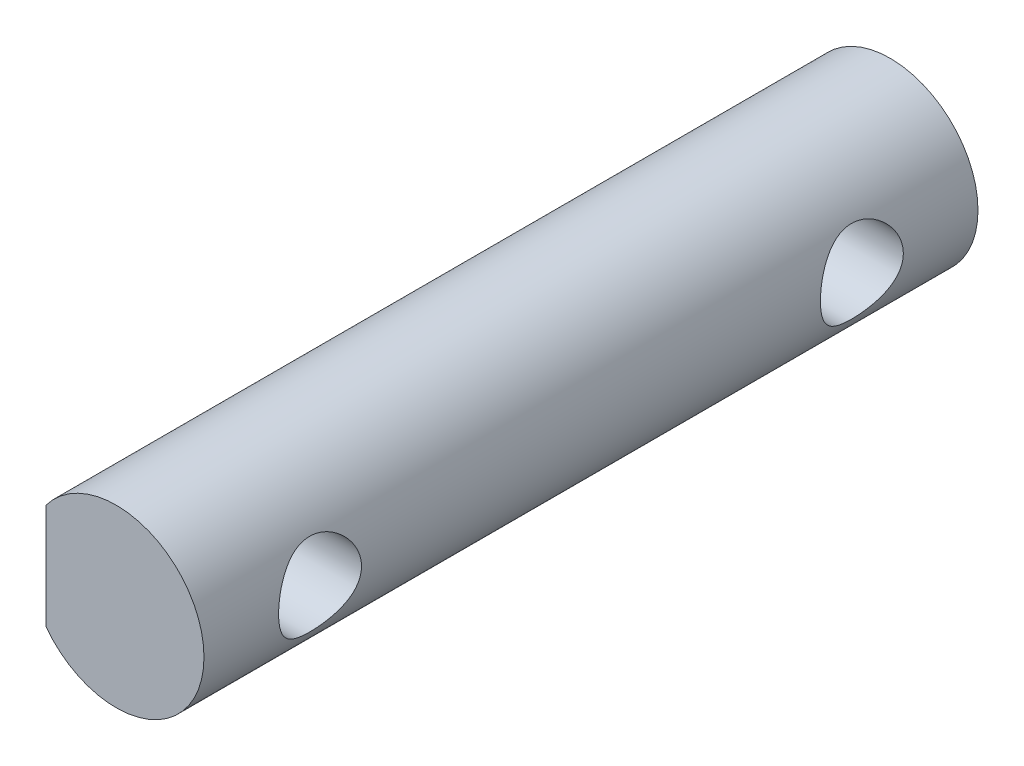
ISO-10303-21;
HEADER;
FILE_DESCRIPTION(('STEP AP214'),'2;1');
FILE_NAME('part.step','',(''),(''),'','','');
FILE_SCHEMA(('AUTOMOTIVE_DESIGN { 1 0 10303 214 1 1 1 1 }'));
ENDSEC;
DATA;
#1=APPLICATION_CONTEXT('core data for automotive mechanical design processes');
#2=APPLICATION_PROTOCOL_DEFINITION('international standard','automotive_design',2000,#1);
#3=PRODUCT_CONTEXT('',#1,'mechanical');
#4=PRODUCT('Part','Part','',(#3));
#5=PRODUCT_RELATED_PRODUCT_CATEGORY('part','',(#4));
#6=PRODUCT_DEFINITION_FORMATION('','',#4);
#7=PRODUCT_DEFINITION_CONTEXT('part definition',#1,'design');
#8=PRODUCT_DEFINITION('design','',#6,#7);
#9=PRODUCT_DEFINITION_SHAPE('','',#8);
#10=(LENGTH_UNIT() NAMED_UNIT(*) SI_UNIT(.MILLI.,.METRE.));
#11=(NAMED_UNIT(*) PLANE_ANGLE_UNIT() SI_UNIT($,.RADIAN.));
#12=(NAMED_UNIT(*) SI_UNIT($,.STERADIAN.) SOLID_ANGLE_UNIT());
#13=UNCERTAINTY_MEASURE_WITH_UNIT(LENGTH_MEASURE(1.E-05),#10,'distance_accuracy_value','');
#14=(GEOMETRIC_REPRESENTATION_CONTEXT(3) GLOBAL_UNCERTAINTY_ASSIGNED_CONTEXT((#13)) GLOBAL_UNIT_ASSIGNED_CONTEXT((#10,
#11,#12)) REPRESENTATION_CONTEXT('',''));
#15=CARTESIAN_POINT('',(0.,0.,0.));
#16=DIRECTION('',(0.,0.,1.));
#17=DIRECTION('',(1.,0.,0.));
#18=AXIS2_PLACEMENT_3D('',#15,#16,#17);
#19=CARTESIAN_POINT('',(0.,0.,28.));
#20=DIRECTION('',(0.,0.,-1.));
#21=DIRECTION('',(-1.,0.,0.));
#22=AXIS2_PLACEMENT_3D('',#19,#20,#21);
#23=CYLINDRICAL_SURFACE('',#22,3.175);
#24=CARTESIAN_POINT('',(3.175,0.,5.7));
#25=CARTESIAN_POINT('',(3.17499621985294,-0.0793696056331877,5.69999552610351));
#26=CARTESIAN_POINT('',(3.17199120370814,-0.158848966213319,5.69366335348418));
#27=CARTESIAN_POINT('',(3.16026762742416,-0.3154907966577,5.6685996128575));
#28=CARTESIAN_POINT('',(3.15153670753249,-0.392647876041672,5.64984122112576));
#29=CARTESIAN_POINT('',(3.1292818514019,-0.54213461401645,5.60080463386028));
#30=CARTESIAN_POINT('',(3.11577583396693,-0.614481134826974,5.57056947468804));
#31=CARTESIAN_POINT('',(3.08523557557938,-0.75298275747988,5.49964446831745));
#32=CARTESIAN_POINT('',(3.06820187122341,-0.819138798737005,5.45895621091421));
#33=CARTESIAN_POINT('',(3.03109215002452,-0.947531977551392,5.36568662754687));
#34=CARTESIAN_POINT('',(3.01089949607389,-1.00934531536298,5.31256891765261));
#35=CARTESIAN_POINT('',(2.97016877751052,-1.12356872804671,5.19709401541805));
#36=CARTESIAN_POINT('',(2.94963048974006,-1.17597245123061,5.13473063351146));
#37=CARTESIAN_POINT('',(2.90895734211161,-1.27340721108708,4.9974843645497));
#38=CARTESIAN_POINT('',(2.88894252906622,-1.31770529611402,4.92204154314482));
#39=CARTESIAN_POINT('',(2.85350194913633,-1.39279860497067,4.76371450605077));
#40=CARTESIAN_POINT('',(2.83807319122874,-1.4236026358555,4.68083518657092));
#41=CARTESIAN_POINT('',(2.81484981523147,-1.46896762087975,4.51481732997647));
#42=CARTESIAN_POINT('',(2.80667245171199,-1.48434942407678,4.43195910458647));
#43=CARTESIAN_POINT('',(2.79782290647243,-1.50096994970779,4.26446669966953));
#44=CARTESIAN_POINT('',(2.79714463118969,-1.5022201551264,4.17983401805993));
#45=CARTESIAN_POINT('',(2.80305593263808,-1.49114871052963,4.02062469140227));
#46=CARTESIAN_POINT('',(2.80889771224103,-1.48022366031689,3.94591684055565));
#47=CARTESIAN_POINT('',(2.82589657910714,-1.44750469243097,3.79955531913525));
#48=CARTESIAN_POINT('',(2.83705508237193,-1.42570787921159,3.72790246774061));
#49=CARTESIAN_POINT('',(2.86368711079333,-1.37144042107045,3.58767854274785));
#50=CARTESIAN_POINT('',(2.87925460442575,-1.33873421633754,3.5192173067294));
#51=CARTESIAN_POINT('',(2.91294481240157,-1.26375034917989,3.38844422930819));
#52=CARTESIAN_POINT('',(2.93106865023239,-1.22146847336964,3.32613511227864));
#53=CARTESIAN_POINT('',(2.97027967308475,-1.12301829304094,3.20211398210142));
#54=CARTESIAN_POINT('',(2.99147184174414,-1.06582685913966,3.14124465826451));
#55=CARTESIAN_POINT('',(3.03276969244737,-0.941911654521739,3.02963307898786));
#56=CARTESIAN_POINT('',(3.05287495516681,-0.875184240523148,2.97889471198725));
#57=CARTESIAN_POINT('',(3.09065813188422,-0.730900451942526,2.8872344695054));
#58=CARTESIAN_POINT('',(3.10821737934191,-0.65303276474939,2.8467498749094));
#59=CARTESIAN_POINT('',(3.13795896561378,-0.490549806409964,2.77976514725872));
#60=CARTESIAN_POINT('',(3.15014513198241,-0.405939389394616,2.75325505672055));
#61=CARTESIAN_POINT('',(3.16698849385516,-0.239325331183663,2.71695327830054));
#62=CARTESIAN_POINT('',(3.17215069636453,-0.157618085372369,2.70603697774866));
#63=CARTESIAN_POINT('',(3.17605374308904,0.00662006237334145,2.69776549827472));
#64=CARTESIAN_POINT('',(3.17479716715133,0.0891506200914326,2.70040487103399));
#65=CARTESIAN_POINT('',(3.16631250425399,0.246790904756254,2.71845895022593));
#66=CARTESIAN_POINT('',(3.15949303898597,0.322025617263288,2.73299968212114));
#67=CARTESIAN_POINT('',(3.14106249856194,0.468859911387633,2.77312746629384));
#68=CARTESIAN_POINT('',(3.12945086824544,0.540459070755478,2.79871579842438));
#69=CARTESIAN_POINT('',(3.10206629000487,0.680482664613306,2.86097277598054));
#70=CARTESIAN_POINT('',(3.0861775760538,0.748744433690326,2.8979545958558));
#71=CARTESIAN_POINT('',(3.05182842645659,0.878333413113474,2.98160542554883));
#72=CARTESIAN_POINT('',(3.0333668635778,0.939657562453442,3.02827868585652));
#73=CARTESIAN_POINT('',(2.99374847615918,1.05944471500475,3.13484016430619));
#74=CARTESIAN_POINT('',(2.97249840501299,1.11715821701519,3.19553803008255));
#75=CARTESIAN_POINT('',(2.9310107026401,1.22187582163969,3.32592004337329));
#76=CARTESIAN_POINT('',(2.91077359415055,1.26887443843489,3.39560876557417));
#77=CARTESIAN_POINT('',(2.87298422238289,1.3523177360002,3.54515860569975));
#78=CARTESIAN_POINT('',(2.85555063245793,1.3883357483136,3.62529027685059));
#79=CARTESIAN_POINT('',(2.82679504093384,1.44599796651068,3.79157573608092));
#80=CARTESIAN_POINT('',(2.81546607860886,1.46765854978947,3.87772253828127));
#81=CARTESIAN_POINT('',(2.80148148307169,1.49416555358527,4.04513659709301));
#82=CARTESIAN_POINT('',(2.79812792823292,1.50036748851185,4.12613047173133));
#83=CARTESIAN_POINT('',(2.79854075870541,1.4995991124721,4.2880256718279));
#84=CARTESIAN_POINT('',(2.80230499174775,1.4926327833113,4.36892701786344));
#85=CARTESIAN_POINT('',(2.81582109373829,1.46695547456854,4.52186185816674));
#86=CARTESIAN_POINT('',(2.82509293077013,1.44918362899975,4.59410031570899));
#87=CARTESIAN_POINT('',(2.84807658169596,1.40347262111118,4.73452895410737));
#88=CARTESIAN_POINT('',(2.86178973121637,1.37553039996268,4.8027179098565));
#89=CARTESIAN_POINT('',(2.89323433363553,1.30816165903836,4.93811055182919));
#90=CARTESIAN_POINT('',(2.9111726221189,1.26809407534009,5.0049459695603));
#91=CARTESIAN_POINT('',(2.94862781691945,1.17838069734069,5.13136079818432));
#92=CARTESIAN_POINT('',(2.96814547541437,1.12873032344155,5.19093671747963));
#93=CARTESIAN_POINT('',(3.00898948839188,1.01518945377103,5.3075560784686));
#94=CARTESIAN_POINT('',(3.03029315236505,0.950355540908534,5.36369381341707));
#95=CARTESIAN_POINT('',(3.07039060771353,0.811506446201234,5.46444175427494));
#96=CARTESIAN_POINT('',(3.08918318329392,0.737486850130158,5.50904638589811));
#97=CARTESIAN_POINT('',(3.12214803509559,0.58231032335967,5.5850463197749));
#98=CARTESIAN_POINT('',(3.13633626105316,0.501179295246576,5.61648733383919));
#99=CARTESIAN_POINT('',(3.15849550789229,0.334041202489533,5.66490242402554));
#100=CARTESIAN_POINT('',(3.16648489362115,0.2480493570789,5.68191924759624));
#101=CARTESIAN_POINT('',(3.17226666174443,0.134449327489636,5.69420643339842));
#102=CARTESIAN_POINT('',(3.17328951708221,0.10761975081623,5.69637655199677));
#103=CARTESIAN_POINT('',(3.17465683516496,0.0538643319459685,5.69927411038089));
#104=CARTESIAN_POINT('',(3.17500128300303,0.0269384876468131,5.70000151846547));
#105=CARTESIAN_POINT('',(3.175,0.,5.7));
#106=B_SPLINE_CURVE_WITH_KNOTS('',3,(#24,#25,#26,#27,#28,#29,#30,#31,#32,#33,#34,#35,#36,#37,
#38,#39,#40,#41,#42,#43,#44,#45,#46,#47,#48,#49,#50,#51,#52,#53,#54,#55,#56,#57,#58,#59,#60,#61,
#62,#63,#64,#65,#66,#67,#68,#69,#70,#71,#72,#73,#74,#75,#76,#77,#78,#79,#80,#81,#82,#83,#84,#85,
#86,#87,#88,#89,#90,#91,#92,#93,#94,#95,#96,#97,#98,#99,#100,#101,#102,#103,#104,#105),
.UNSPECIFIED.,.T.,.F.,(4,2,2,2,2,2,2,2,2,2,2,2,2,2,2,2,2,2,2,2,2,2,2,2,2,2,2,2,2,2,2,2,2,2,2,2,
2,2,2,2,4),(0.,0.237998863435127,0.476513162034361,0.714141760487185,0.951734239756924,
1.202566267352,1.45356698050229,1.72144991719773,1.98915775546694,2.24170968929962,
2.4940563909499,2.72018464462581,2.94637315667184,3.17780125644152,3.40933138528568,
3.66670059385932,3.92416839616743,4.19124985366182,4.45814074508092,4.70459764976704,
4.9509555058397,5.18069145066332,5.41045401730286,5.6472008989094,5.88405183355053,
6.14213867221335,6.40035735120202,6.66760822573517,6.93455372246492,7.17710763594645,
7.41958821796886,7.64352093670395,7.86752106087491,8.10644389425159,8.34548119240929,
8.60934561245708,8.87333732850241,9.13640455025375,9.39868939422998,9.47946576344206,
9.56024390756228),.UNSPECIFIED.);
#107=CARTESIAN_POINT('',(3.175,0.,5.7));
#108=VERTEX_POINT('',#107);
#109=EDGE_CURVE('E71',#108,#108,#106,.T.);
#110=ORIENTED_EDGE('',*,*,#109,.F.);
#111=EDGE_LOOP('',(#110));
#112=FACE_BOUND('',#111,.T.);
#113=CARTESIAN_POINT('',(3.175,0.,25.3));
#114=CARTESIAN_POINT('',(3.17499621985294,-0.079369605633189,25.2999955261035));
#115=CARTESIAN_POINT('',(3.17199120370814,-0.15884896621332,25.2936633534842));
#116=CARTESIAN_POINT('',(3.16026762742416,-0.315490796657701,25.2685996128575));
#117=CARTESIAN_POINT('',(3.15153670753249,-0.392647876041673,25.2498412211258));
#118=CARTESIAN_POINT('',(3.1292818514019,-0.542134614016451,25.2008046338603));
#119=CARTESIAN_POINT('',(3.11577583396693,-0.614481134826975,25.170569474688));
#120=CARTESIAN_POINT('',(3.08523557557938,-0.752982757479882,25.0996444683175));
#121=CARTESIAN_POINT('',(3.06820187122341,-0.819138798737007,25.0589562109142));
#122=CARTESIAN_POINT('',(3.03109215002452,-0.947531977551394,24.9656866275469));
#123=CARTESIAN_POINT('',(3.01089949607389,-1.00934531536298,24.9125689176526));
#124=CARTESIAN_POINT('',(2.97016877751052,-1.12356872804671,24.7970940154181));
#125=CARTESIAN_POINT('',(2.94963048974006,-1.17597245123061,24.7347306335115));
#126=CARTESIAN_POINT('',(2.90895734211161,-1.27340721108708,24.5974843645497));
#127=CARTESIAN_POINT('',(2.88894252906622,-1.31770529611402,24.5220415431448));
#128=CARTESIAN_POINT('',(2.85350194913633,-1.39279860497067,24.3637145060508));
#129=CARTESIAN_POINT('',(2.83807319122874,-1.4236026358555,24.2808351865709));
#130=CARTESIAN_POINT('',(2.81484981523147,-1.46896762087975,24.1148173299765));
#131=CARTESIAN_POINT('',(2.80667245171199,-1.48434942407678,24.0319591045865));
#132=CARTESIAN_POINT('',(2.79782290647243,-1.50096994970779,23.8644666996695));
#133=CARTESIAN_POINT('',(2.79714463118969,-1.5022201551264,23.7798340180599));
#134=CARTESIAN_POINT('',(2.80305593263809,-1.49114871052963,23.6206246914023));
#135=CARTESIAN_POINT('',(2.80889771224103,-1.48022366031688,23.5459168405557));
#136=CARTESIAN_POINT('',(2.82589657910715,-1.44750469243097,23.3995553191353));
#137=CARTESIAN_POINT('',(2.83705508237193,-1.42570787921159,23.3279024677406));
#138=CARTESIAN_POINT('',(2.86368711079333,-1.37144042107045,23.1876785427479));
#139=CARTESIAN_POINT('',(2.87925460442575,-1.33873421633753,23.1192173067294));
#140=CARTESIAN_POINT('',(2.91294481240157,-1.26375034917988,22.9884442293082));
#141=CARTESIAN_POINT('',(2.93106865023239,-1.22146847336964,22.9261351122786));
#142=CARTESIAN_POINT('',(2.97027967308475,-1.12301829304093,22.8021139821014));
#143=CARTESIAN_POINT('',(2.99147184174414,-1.06582685913966,22.7412446582645));
#144=CARTESIAN_POINT('',(3.03276969244737,-0.941911654521736,22.6296330789879));
#145=CARTESIAN_POINT('',(3.05287495516681,-0.875184240523146,22.5788947119873));
#146=CARTESIAN_POINT('',(3.09065813188422,-0.730900451942524,22.4872344695054));
#147=CARTESIAN_POINT('',(3.10821737934191,-0.653032764749388,22.4467498749094));
#148=CARTESIAN_POINT('',(3.13795896561378,-0.490549806409963,22.3797651472587));
#149=CARTESIAN_POINT('',(3.15014513198241,-0.405939389394615,22.3532550567206));
#150=CARTESIAN_POINT('',(3.16698849385516,-0.239325331183662,22.3169532783005));
#151=CARTESIAN_POINT('',(3.17215069636453,-0.157618085372368,22.3060369777487));
#152=CARTESIAN_POINT('',(3.17605374308904,0.00662006237334188,22.2977654982747));
#153=CARTESIAN_POINT('',(3.17479716715133,0.0891506200914329,22.300404871034));
#154=CARTESIAN_POINT('',(3.16631250425399,0.246790904756254,22.3184589502259));
#155=CARTESIAN_POINT('',(3.15949303898597,0.322025617263288,22.3329996821212));
#156=CARTESIAN_POINT('',(3.14106249856194,0.468859911387632,22.3731274662939));
#157=CARTESIAN_POINT('',(3.12945086824544,0.540459070755478,22.3987157984244));
#158=CARTESIAN_POINT('',(3.10206629000487,0.680482664613306,22.4609727759805));
#159=CARTESIAN_POINT('',(3.0861775760538,0.748744433690325,22.4979545958558));
#160=CARTESIAN_POINT('',(3.0518284264566,0.878333413113473,22.5816054255488));
#161=CARTESIAN_POINT('',(3.0333668635778,0.93965756245344,22.6282786858565));
#162=CARTESIAN_POINT('',(2.99374847615918,1.05944471500474,22.7348401643062));
#163=CARTESIAN_POINT('',(2.97249840501299,1.11715821701518,22.7955380300826));
#164=CARTESIAN_POINT('',(2.9310107026401,1.22187582163969,22.9259200433733));
#165=CARTESIAN_POINT('',(2.91077359415055,1.26887443843489,22.9956087655742));
#166=CARTESIAN_POINT('',(2.8729842223829,1.3523177360002,23.1451586056998));
#167=CARTESIAN_POINT('',(2.85555063245793,1.3883357483136,23.2252902768506));
#168=CARTESIAN_POINT('',(2.82679504093384,1.44599796651068,23.3915757360809));
#169=CARTESIAN_POINT('',(2.81546607860886,1.46765854978946,23.4777225382813));
#170=CARTESIAN_POINT('',(2.80148148307169,1.49416555358527,23.645136597093));
#171=CARTESIAN_POINT('',(2.79812792823293,1.50036748851185,23.7261304717313));
#172=CARTESIAN_POINT('',(2.79854075870542,1.4995991124721,23.8880256718279));
#173=CARTESIAN_POINT('',(2.80230499174775,1.49263278331129,23.9689270178635));
#174=CARTESIAN_POINT('',(2.81582109373829,1.46695547456854,24.1218618581667));
#175=CARTESIAN_POINT('',(2.82509293077013,1.44918362899974,24.194100315709));
#176=CARTESIAN_POINT('',(2.84807658169596,1.40347262111117,24.3345289541074));
#177=CARTESIAN_POINT('',(2.86178973121637,1.37553039996267,24.4027179098565));
#178=CARTESIAN_POINT('',(2.89323433363553,1.30816165903835,24.5381105518292));
#179=CARTESIAN_POINT('',(2.9111726221189,1.26809407534009,24.6049459695603));
#180=CARTESIAN_POINT('',(2.94862781691945,1.17838069734069,24.7313607981843));
#181=CARTESIAN_POINT('',(2.96814547541437,1.12873032344155,24.7909367174796));
#182=CARTESIAN_POINT('',(3.00898948839188,1.01518945377102,24.9075560784686));
#183=CARTESIAN_POINT('',(3.03029315236505,0.950355540908527,24.9636938134171));
#184=CARTESIAN_POINT('',(3.07039060771353,0.811506446201227,25.0644417542749));
#185=CARTESIAN_POINT('',(3.08918318329392,0.737486850130152,25.1090463858981));
#186=CARTESIAN_POINT('',(3.12214803509559,0.582310323359664,25.1850463197749));
#187=CARTESIAN_POINT('',(3.13633626105316,0.50117929524657,25.2164873338392));
#188=CARTESIAN_POINT('',(3.15849550789229,0.334041202489527,25.2649024240255));
#189=CARTESIAN_POINT('',(3.16648489362115,0.248049357078894,25.2819192475962));
#190=CARTESIAN_POINT('',(3.17226666174443,0.134449327489631,25.2942064333984));
#191=CARTESIAN_POINT('',(3.17328951708221,0.107619750816226,25.2963765519968));
#192=CARTESIAN_POINT('',(3.17465683516496,0.053864331945966,25.2992741103809));
#193=CARTESIAN_POINT('',(3.17500128300303,0.0269384876468112,25.3000015184655));
#194=CARTESIAN_POINT('',(3.175,0.,25.3));
#195=B_SPLINE_CURVE_WITH_KNOTS('',3,(#113,#114,#115,#116,#117,#118,#119,#120,#121,#122,#123,
#124,#125,#126,#127,#128,#129,#130,#131,#132,#133,#134,#135,#136,#137,#138,#139,#140,#141,#142,
#143,#144,#145,#146,#147,#148,#149,#150,#151,#152,#153,#154,#155,#156,#157,#158,#159,#160,#161,
#162,#163,#164,#165,#166,#167,#168,#169,#170,#171,#172,#173,#174,#175,#176,#177,#178,#179,#180,
#181,#182,#183,#184,#185,#186,#187,#188,#189,#190,#191,#192,#193,#194),.UNSPECIFIED.,.T.,.F.,(4,
2,2,2,2,2,2,2,2,2,2,2,2,2,2,2,2,2,2,2,2,2,2,2,2,2,2,2,2,2,2,2,2,2,2,2,2,2,2,2,4),(0.,
0.237998863435127,0.476513162034361,0.714141760487185,0.951734239756925,1.202566267352,
1.45356698050229,1.72144991719773,1.98915775546694,2.24170968929963,2.4940563909499,
2.72018464462581,2.94637315667183,3.17780125644152,3.40933138528568,3.66670059385932,
3.92416839616743,4.19124985366182,4.45814074508091,4.70459764976703,4.9509555058397,
5.18069145066331,5.41045401730285,5.64720089890939,5.88405183355052,6.14213867221334,
6.40035735120202,6.66760822573517,6.93455372246491,7.17710763594645,7.41958821796885,
7.64352093670394,7.8675210608749,8.10644389425158,8.34548119240928,8.60934561245707,
8.87333732850239,9.13640455025374,9.39868939422997,9.47946576344204,9.56024390756226),.UNSPECIFIED.);
#196=CARTESIAN_POINT('',(3.175,0.,25.3));
#197=VERTEX_POINT('',#196);
#198=EDGE_CURVE('E79',#197,#197,#195,.T.);
#199=ORIENTED_EDGE('',*,*,#198,.F.);
#200=EDGE_LOOP('',(#199));
#201=FACE_BOUND('',#200,.T.);
#202=CARTESIAN_POINT('',(0.,0.,0.));
#203=DIRECTION('',(0.,0.,1.));
#204=DIRECTION('',(1.,0.,0.));
#205=AXIS2_PLACEMENT_3D('',#202,#203,#204);
#206=CIRCLE('',#205,3.175);
#207=CARTESIAN_POINT('',(-2.54,-1.905,0.));
#208=VERTEX_POINT('',#207);
#209=CARTESIAN_POINT('',(-2.54,1.905,0.));
#210=VERTEX_POINT('',#209);
#211=EDGE_CURVE('E67',#208,#210,#206,.T.);
#212=ORIENTED_EDGE('',*,*,#211,.T.);
#213=DIRECTION('',(0.,0.,-1.));
#214=VECTOR('',#213,1.);
#215=CARTESIAN_POINT('',(-2.54,1.905,28.));
#216=LINE('',#215,#214);
#217=CARTESIAN_POINT('',(-2.54,1.905,28.));
#218=VERTEX_POINT('',#217);
#219=EDGE_CURVE('E11',#218,#210,#216,.T.);
#220=ORIENTED_EDGE('',*,*,#219,.F.);
#221=CARTESIAN_POINT('',(0.,0.,28.));
#222=DIRECTION('',(0.,0.,1.));
#223=DIRECTION('',(1.,0.,0.));
#224=AXIS2_PLACEMENT_3D('',#221,#222,#223);
#225=CIRCLE('',#224,3.175);
#226=CARTESIAN_POINT('',(-2.54,-1.905,28.));
#227=VERTEX_POINT('',#226);
#228=EDGE_CURVE('E66',#227,#218,#225,.T.);
#229=ORIENTED_EDGE('',*,*,#228,.F.);
#230=DIRECTION('',(0.,0.,-1.));
#231=VECTOR('',#230,1.);
#232=CARTESIAN_POINT('',(-2.54,-1.905,28.));
#233=LINE('',#232,#231);
#234=EDGE_CURVE('E44',#227,#208,#233,.T.);
#235=ORIENTED_EDGE('',*,*,#234,.T.);
#236=EDGE_LOOP('',(#212,#220,#229,#235));
#237=FACE_BOUND('',#236,.T.);
#238=ADVANCED_FACE('F36',(#112,#201,#237),#23,.T.);
#239=CARTESIAN_POINT('',(-2.54,1.905,28.));
#240=DIRECTION('',(1.,0.,0.));
#241=DIRECTION('',(0.,0.,-1.));
#242=AXIS2_PLACEMENT_3D('',#239,#240,#241);
#243=PLANE('',#242);
#244=CARTESIAN_POINT('',(-2.54,0.,4.2));
#245=DIRECTION('',(-1.,0.,0.));
#246=DIRECTION('',(0.,0.,1.));
#247=AXIS2_PLACEMENT_3D('',#244,#245,#246);
#248=CIRCLE('',#247,1.5);
#249=CARTESIAN_POINT('',(-2.54,0.,5.7));
#250=VERTEX_POINT('',#249);
#251=EDGE_CURVE('E74',#250,#250,#248,.T.);
#252=ORIENTED_EDGE('',*,*,#251,.F.);
#253=EDGE_LOOP('',(#252));
#254=FACE_BOUND('',#253,.T.);
#255=CARTESIAN_POINT('',(-2.54,0.,23.8));
#256=DIRECTION('',(-1.,0.,0.));
#257=DIRECTION('',(0.,0.,1.));
#258=AXIS2_PLACEMENT_3D('',#255,#256,#257);
#259=CIRCLE('',#258,1.5);
#260=CARTESIAN_POINT('',(-2.54,0.,25.3));
#261=VERTEX_POINT('',#260);
#262=EDGE_CURVE('E87',#261,#261,#259,.T.);
#263=ORIENTED_EDGE('',*,*,#262,.F.);
#264=EDGE_LOOP('',(#263));
#265=FACE_BOUND('',#264,.T.);
#266=DIRECTION('',(0.,-1.,0.));
#267=VECTOR('',#266,1.);
#268=CARTESIAN_POINT('',(-2.54,1.905,0.));
#269=LINE('',#268,#267);
#270=EDGE_CURVE('E59',#210,#208,#269,.T.);
#271=ORIENTED_EDGE('',*,*,#270,.T.);
#272=ORIENTED_EDGE('',*,*,#234,.F.);
#273=DIRECTION('',(0.,-1.,0.));
#274=VECTOR('',#273,1.);
#275=CARTESIAN_POINT('',(-2.54,1.905,28.));
#276=LINE('',#275,#274);
#277=EDGE_CURVE('E51',#218,#227,#276,.T.);
#278=ORIENTED_EDGE('',*,*,#277,.F.);
#279=ORIENTED_EDGE('',*,*,#219,.T.);
#280=EDGE_LOOP('',(#271,#272,#278,#279));
#281=FACE_BOUND('',#280,.T.);
#282=ADVANCED_FACE('F62',(#254,#265,#281),#243,.F.);
#283=CARTESIAN_POINT('',(0.,0.,28.));
#284=DIRECTION('',(0.,0.,1.));
#285=DIRECTION('',(1.,0.,0.));
#286=AXIS2_PLACEMENT_3D('',#283,#284,#285);
#287=PLANE('',#286);
#288=ORIENTED_EDGE('',*,*,#228,.T.);
#289=ORIENTED_EDGE('',*,*,#277,.T.);
#290=EDGE_LOOP('',(#288,#289));
#291=FACE_BOUND('',#290,.T.);
#292=ADVANCED_FACE('F93',(#291),#287,.T.);
#293=CARTESIAN_POINT('',(0.,0.,0.));
#294=DIRECTION('',(0.,0.,1.));
#295=DIRECTION('',(1.,0.,0.));
#296=AXIS2_PLACEMENT_3D('',#293,#294,#295);
#297=PLANE('',#296);
#298=ORIENTED_EDGE('',*,*,#211,.F.);
#299=ORIENTED_EDGE('',*,*,#270,.F.);
#300=EDGE_LOOP('',(#298,#299));
#301=FACE_BOUND('',#300,.T.);
#302=ADVANCED_FACE('F70',(#301),#297,.F.);
#303=CARTESIAN_POINT('',(3.176,0.,23.8));
#304=DIRECTION('',(-1.,0.,0.));
#305=DIRECTION('',(0.,0.,1.));
#306=AXIS2_PLACEMENT_3D('',#303,#304,#305);
#307=CYLINDRICAL_SURFACE('',#306,1.5);
#308=ORIENTED_EDGE('',*,*,#198,.T.);
#309=EDGE_LOOP('',(#308));
#310=FACE_BOUND('',#309,.T.);
#311=ORIENTED_EDGE('',*,*,#262,.T.);
#312=EDGE_LOOP('',(#311));
#313=FACE_BOUND('',#312,.T.);
#314=ADVANCED_FACE('F88',(#310,#313),#307,.F.);
#315=CARTESIAN_POINT('',(3.176,0.,4.2));
#316=DIRECTION('',(-1.,0.,0.));
#317=DIRECTION('',(0.,0.,1.));
#318=AXIS2_PLACEMENT_3D('',#315,#316,#317);
#319=CYLINDRICAL_SURFACE('',#318,1.5);
#320=ORIENTED_EDGE('',*,*,#109,.T.);
#321=EDGE_LOOP('',(#320));
#322=FACE_BOUND('',#321,.T.);
#323=ORIENTED_EDGE('',*,*,#251,.T.);
#324=EDGE_LOOP('',(#323));
#325=FACE_BOUND('',#324,.T.);
#326=ADVANCED_FACE('F110',(#322,#325),#319,.F.);
#327=CLOSED_SHELL('',(#238,#282,#292,#302,#314,#326));
#328=MANIFOLD_SOLID_BREP('B2',#327);
#329=ADVANCED_BREP_SHAPE_REPRESENTATION('',(#18,#328),#14);
#330=SHAPE_DEFINITION_REPRESENTATION(#9,#329);
ENDSEC;
END-ISO-10303-21;
